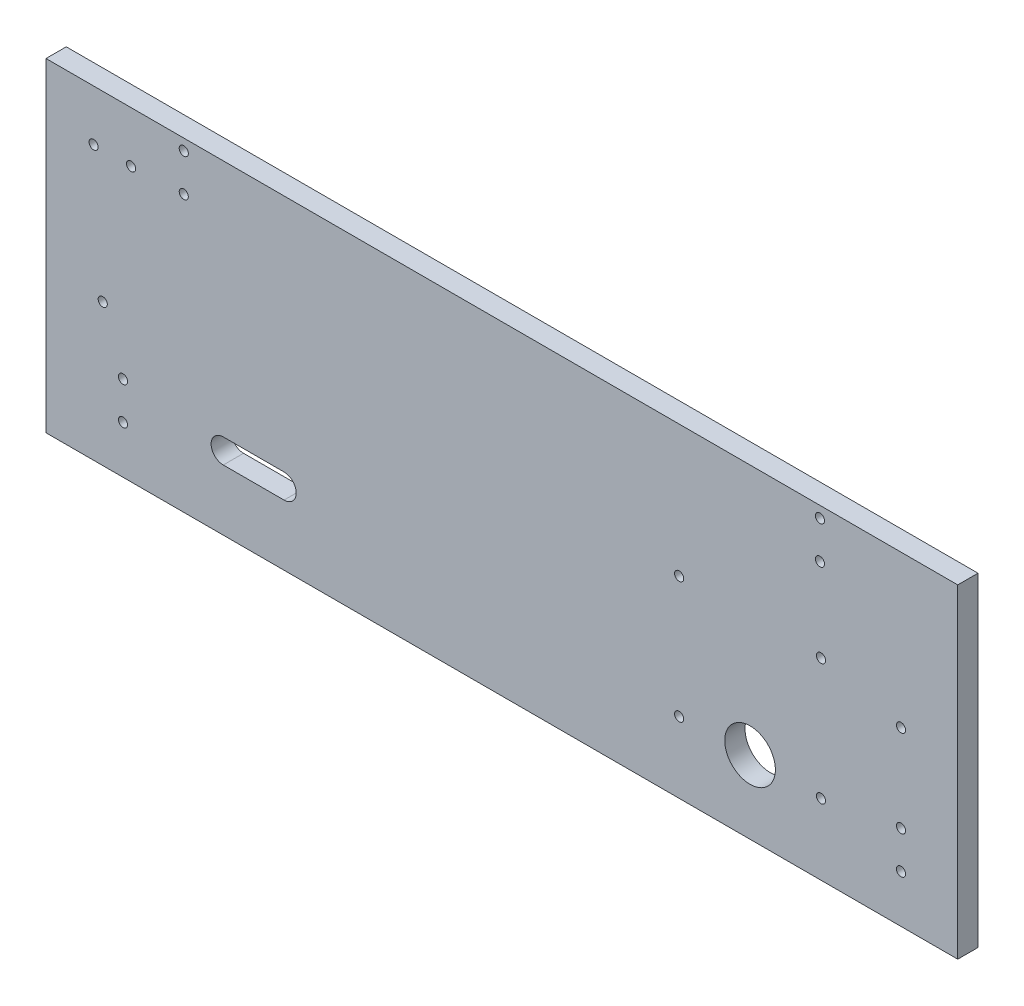
ISO-10303-21;
HEADER;
FILE_DESCRIPTION(('STEP AP214'),'2;1');
FILE_NAME('part.step','',(''),(''),'','','');
FILE_SCHEMA(('AUTOMOTIVE_DESIGN { 1 0 10303 214 1 1 1 1 }'));
ENDSEC;
DATA;
#1=APPLICATION_CONTEXT('core data for automotive mechanical design processes');
#2=APPLICATION_PROTOCOL_DEFINITION('international standard','automotive_design',2000,#1);
#3=PRODUCT_CONTEXT('',#1,'mechanical');
#4=PRODUCT('Part','Part','',(#3));
#5=PRODUCT_RELATED_PRODUCT_CATEGORY('part','',(#4));
#6=PRODUCT_DEFINITION_FORMATION('','',#4);
#7=PRODUCT_DEFINITION_CONTEXT('part definition',#1,'design');
#8=PRODUCT_DEFINITION('design','',#6,#7);
#9=PRODUCT_DEFINITION_SHAPE('','',#8);
#10=(LENGTH_UNIT() NAMED_UNIT(*) SI_UNIT(.MILLI.,.METRE.));
#11=(NAMED_UNIT(*) PLANE_ANGLE_UNIT() SI_UNIT($,.RADIAN.));
#12=(NAMED_UNIT(*) SI_UNIT($,.STERADIAN.) SOLID_ANGLE_UNIT());
#13=UNCERTAINTY_MEASURE_WITH_UNIT(LENGTH_MEASURE(1.E-05),#10,'distance_accuracy_value','');
#14=(GEOMETRIC_REPRESENTATION_CONTEXT(3) GLOBAL_UNCERTAINTY_ASSIGNED_CONTEXT((#13)) GLOBAL_UNIT_ASSIGNED_CONTEXT((#10,
#11,#12)) REPRESENTATION_CONTEXT('',''));
#15=CARTESIAN_POINT('',(0.,0.,0.));
#16=DIRECTION('',(0.,0.,1.));
#17=DIRECTION('',(1.,0.,0.));
#18=AXIS2_PLACEMENT_3D('',#15,#16,#17);
#19=CARTESIAN_POINT('',(0.,0.,10.));
#20=DIRECTION('',(1.,0.,0.));
#21=DIRECTION('',(0.,0.,-1.));
#22=AXIS2_PLACEMENT_3D('',#19,#20,#21);
#23=PLANE('',#22);
#24=DIRECTION('',(0.,-1.,0.));
#25=VECTOR('',#24,1.);
#26=CARTESIAN_POINT('',(0.,0.,0.));
#27=LINE('',#26,#25);
#28=CARTESIAN_POINT('',(0.,160.,0.));
#29=VERTEX_POINT('',#28);
#30=CARTESIAN_POINT('',(0.,0.,0.));
#31=VERTEX_POINT('',#30);
#32=EDGE_CURVE('E158',#29,#31,#27,.T.);
#33=ORIENTED_EDGE('',*,*,#32,.T.);
#34=DIRECTION('',(0.,0.,-1.));
#35=VECTOR('',#34,1.);
#36=CARTESIAN_POINT('',(0.,0.,10.));
#37=LINE('',#36,#35);
#38=CARTESIAN_POINT('',(0.,0.,10.));
#39=VERTEX_POINT('',#38);
#40=EDGE_CURVE('E11',#39,#31,#37,.T.);
#41=ORIENTED_EDGE('',*,*,#40,.F.);
#42=DIRECTION('',(0.,-1.,0.));
#43=VECTOR('',#42,1.);
#44=CARTESIAN_POINT('',(0.,0.,10.));
#45=LINE('',#44,#43);
#46=CARTESIAN_POINT('',(0.,160.,10.));
#47=VERTEX_POINT('',#46);
#48=EDGE_CURVE('E160',#47,#39,#45,.T.);
#49=ORIENTED_EDGE('',*,*,#48,.F.);
#50=DIRECTION('',(0.,0.,-1.));
#51=VECTOR('',#50,1.);
#52=CARTESIAN_POINT('',(0.,160.,10.));
#53=LINE('',#52,#51);
#54=EDGE_CURVE('E170',#47,#29,#53,.T.);
#55=ORIENTED_EDGE('',*,*,#54,.T.);
#56=EDGE_LOOP('',(#33,#41,#49,#55));
#57=FACE_BOUND('',#56,.T.);
#58=ADVANCED_FACE('F37',(#57),#23,.F.);
#59=CARTESIAN_POINT('',(0.,0.,10.));
#60=DIRECTION('',(0.,1.,0.));
#61=DIRECTION('',(0.,0.,1.));
#62=AXIS2_PLACEMENT_3D('',#59,#60,#61);
#63=PLANE('',#62);
#64=DIRECTION('',(1.,0.,0.));
#65=VECTOR('',#64,1.);
#66=CARTESIAN_POINT('',(0.,0.,0.));
#67=LINE('',#66,#65);
#68=CARTESIAN_POINT('',(450.,0.,0.));
#69=VERTEX_POINT('',#68);
#70=EDGE_CURVE('E173',#31,#69,#67,.T.);
#71=ORIENTED_EDGE('',*,*,#70,.T.);
#72=DIRECTION('',(0.,0.,-1.));
#73=VECTOR('',#72,1.);
#74=CARTESIAN_POINT('',(450.,0.,10.));
#75=LINE('',#74,#73);
#76=CARTESIAN_POINT('',(450.,0.,10.));
#77=VERTEX_POINT('',#76);
#78=EDGE_CURVE('E44',#77,#69,#75,.T.);
#79=ORIENTED_EDGE('',*,*,#78,.F.);
#80=DIRECTION('',(1.,0.,0.));
#81=VECTOR('',#80,1.);
#82=CARTESIAN_POINT('',(0.,0.,10.));
#83=LINE('',#82,#81);
#84=EDGE_CURVE('E163',#39,#77,#83,.T.);
#85=ORIENTED_EDGE('',*,*,#84,.F.);
#86=ORIENTED_EDGE('',*,*,#40,.T.);
#87=EDGE_LOOP('',(#71,#79,#85,#86));
#88=FACE_BOUND('',#87,.T.);
#89=ADVANCED_FACE('F202',(#88),#63,.F.);
#90=CARTESIAN_POINT('',(450.,0.,10.));
#91=DIRECTION('',(-1.,0.,0.));
#92=DIRECTION('',(0.,0.,1.));
#93=AXIS2_PLACEMENT_3D('',#90,#91,#92);
#94=PLANE('',#93);
#95=DIRECTION('',(0.,1.,0.));
#96=VECTOR('',#95,1.);
#97=CARTESIAN_POINT('',(450.,0.,0.));
#98=LINE('',#97,#96);
#99=CARTESIAN_POINT('',(450.,160.,0.));
#100=VERTEX_POINT('',#99);
#101=EDGE_CURVE('E175',#69,#100,#98,.T.);
#102=ORIENTED_EDGE('',*,*,#101,.T.);
#103=DIRECTION('',(0.,0.,-1.));
#104=VECTOR('',#103,1.);
#105=CARTESIAN_POINT('',(450.,160.,10.));
#106=LINE('',#105,#104);
#107=CARTESIAN_POINT('',(450.,160.,10.));
#108=VERTEX_POINT('',#107);
#109=EDGE_CURVE('E180',#108,#100,#106,.T.);
#110=ORIENTED_EDGE('',*,*,#109,.F.);
#111=DIRECTION('',(0.,1.,0.));
#112=VECTOR('',#111,1.);
#113=CARTESIAN_POINT('',(450.,0.,10.));
#114=LINE('',#113,#112);
#115=EDGE_CURVE('E166',#77,#108,#114,.T.);
#116=ORIENTED_EDGE('',*,*,#115,.F.);
#117=ORIENTED_EDGE('',*,*,#78,.T.);
#118=EDGE_LOOP('',(#102,#110,#116,#117));
#119=FACE_BOUND('',#118,.T.);
#120=ADVANCED_FACE('F187',(#119),#94,.F.);
#121=CARTESIAN_POINT('',(0.,160.,10.));
#122=DIRECTION('',(0.,-1.,0.));
#123=DIRECTION('',(0.,0.,-1.));
#124=AXIS2_PLACEMENT_3D('',#121,#122,#123);
#125=PLANE('',#124);
#126=DIRECTION('',(-1.,0.,0.));
#127=VECTOR('',#126,1.);
#128=CARTESIAN_POINT('',(0.,160.,0.));
#129=LINE('',#128,#127);
#130=EDGE_CURVE('E164',#100,#29,#129,.T.);
#131=ORIENTED_EDGE('',*,*,#130,.T.);
#132=ORIENTED_EDGE('',*,*,#54,.F.);
#133=DIRECTION('',(-1.,0.,0.));
#134=VECTOR('',#133,1.);
#135=CARTESIAN_POINT('',(0.,160.,10.));
#136=LINE('',#135,#134);
#137=EDGE_CURVE('E168',#108,#47,#136,.T.);
#138=ORIENTED_EDGE('',*,*,#137,.F.);
#139=ORIENTED_EDGE('',*,*,#109,.T.);
#140=EDGE_LOOP('',(#131,#132,#138,#139));
#141=FACE_BOUND('',#140,.T.);
#142=ADVANCED_FACE('F196',(#141),#125,.F.);
#143=CARTESIAN_POINT('',(0.,0.,10.));
#144=DIRECTION('',(0.,0.,-1.));
#145=DIRECTION('',(-1.,0.,0.));
#146=AXIS2_PLACEMENT_3D('',#143,#144,#145);
#147=PLANE('',#146);
#148=CARTESIAN_POINT('',(382.,154.5,10.));
#149=DIRECTION('',(0.,0.,1.));
#150=DIRECTION('',(1.,0.,0.));
#151=AXIS2_PLACEMENT_3D('',#148,#149,#150);
#152=CIRCLE('',#151,2.24999999999996);
#153=CARTESIAN_POINT('',(384.25,154.5,10.));
#154=VERTEX_POINT('',#153);
#155=EDGE_CURVE('E341',#154,#154,#152,.T.);
#156=ORIENTED_EDGE('',*,*,#155,.F.);
#157=EDGE_LOOP('',(#156));
#158=FACE_BOUND('',#157,.T.);
#159=CARTESIAN_POINT('',(68.0000000000001,136.,10.));
#160=DIRECTION('',(0.,0.,1.));
#161=DIRECTION('',(1.,0.,0.));
#162=AXIS2_PLACEMENT_3D('',#159,#160,#161);
#163=CIRCLE('',#162,2.25);
#164=CARTESIAN_POINT('',(70.2500000000001,136.,10.));
#165=VERTEX_POINT('',#164);
#166=EDGE_CURVE('E334',#165,#165,#163,.T.);
#167=ORIENTED_EDGE('',*,*,#166,.F.);
#168=EDGE_LOOP('',(#167));
#169=FACE_BOUND('',#168,.T.);
#170=CARTESIAN_POINT('',(422.,85.,10.));
#171=DIRECTION('',(0.,0.,1.));
#172=DIRECTION('',(1.,0.,0.));
#173=AXIS2_PLACEMENT_3D('',#170,#171,#172);
#174=CIRCLE('',#173,2.24999999999995);
#175=CARTESIAN_POINT('',(424.25,85.,10.));
#176=VERTEX_POINT('',#175);
#177=EDGE_CURVE('E353',#176,#176,#174,.T.);
#178=ORIENTED_EDGE('',*,*,#177,.F.);
#179=EDGE_LOOP('',(#178));
#180=FACE_BOUND('',#179,.T.);
#181=CARTESIAN_POINT('',(68.0000000000001,154.5,10.));
#182=DIRECTION('',(0.,0.,1.));
#183=DIRECTION('',(1.,0.,0.));
#184=AXIS2_PLACEMENT_3D('',#181,#182,#183);
#185=CIRCLE('',#184,2.25);
#186=CARTESIAN_POINT('',(70.2500000000001,154.5,10.));
#187=VERTEX_POINT('',#186);
#188=EDGE_CURVE('E346',#187,#187,#185,.T.);
#189=ORIENTED_EDGE('',*,*,#188,.F.);
#190=EDGE_LOOP('',(#189));
#191=FACE_BOUND('',#190,.T.);
#192=CARTESIAN_POINT('',(422.,41.9999999999999,10.));
#193=DIRECTION('',(0.,0.,1.));
#194=DIRECTION('',(1.,0.,0.));
#195=AXIS2_PLACEMENT_3D('',#192,#193,#194);
#196=CIRCLE('',#195,2.24999999999995);
#197=CARTESIAN_POINT('',(424.25,41.9999999999999,10.));
#198=VERTEX_POINT('',#197);
#199=EDGE_CURVE('E309',#198,#198,#196,.T.);
#200=ORIENTED_EDGE('',*,*,#199,.F.);
#201=EDGE_LOOP('',(#200));
#202=FACE_BOUND('',#201,.T.);
#203=CARTESIAN_POINT('',(38.,23.5,10.));
#204=DIRECTION('',(0.,0.,1.));
#205=DIRECTION('',(1.,0.,0.));
#206=AXIS2_PLACEMENT_3D('',#203,#204,#205);
#207=CIRCLE('',#206,2.25);
#208=CARTESIAN_POINT('',(40.25,23.5,10.));
#209=VERTEX_POINT('',#208);
#210=EDGE_CURVE('E313',#209,#209,#207,.T.);
#211=ORIENTED_EDGE('',*,*,#210,.F.);
#212=EDGE_LOOP('',(#211));
#213=FACE_BOUND('',#212,.T.);
#214=CARTESIAN_POINT('',(38.,42.,10.));
#215=DIRECTION('',(0.,0.,1.));
#216=DIRECTION('',(1.,0.,0.));
#217=AXIS2_PLACEMENT_3D('',#214,#215,#216);
#218=CIRCLE('',#217,2.25);
#219=CARTESIAN_POINT('',(40.25,42.,10.));
#220=VERTEX_POINT('',#219);
#221=EDGE_CURVE('E329',#220,#220,#218,.T.);
#222=ORIENTED_EDGE('',*,*,#221,.F.);
#223=EDGE_LOOP('',(#222));
#224=FACE_BOUND('',#223,.T.);
#225=CARTESIAN_POINT('',(382.,136.,10.));
#226=DIRECTION('',(0.,0.,1.));
#227=DIRECTION('',(1.,0.,0.));
#228=AXIS2_PLACEMENT_3D('',#225,#226,#227);
#229=CIRCLE('',#228,2.24999999999996);
#230=CARTESIAN_POINT('',(384.25,136.,10.));
#231=VERTEX_POINT('',#230);
#232=EDGE_CURVE('E322',#231,#231,#229,.T.);
#233=ORIENTED_EDGE('',*,*,#232,.F.);
#234=EDGE_LOOP('',(#233));
#235=FACE_BOUND('',#234,.T.);
#236=DIRECTION('',(1.,0.,0.));
#237=VECTOR('',#236,1.);
#238=CARTESIAN_POINT('',(87.5,30.,10.));
#239=LINE('',#238,#237);
#240=CARTESIAN_POINT('',(87.5,30.,10.));
#241=VERTEX_POINT('',#240);
#242=CARTESIAN_POINT('',(117.5,30.,10.));
#243=VERTEX_POINT('',#242);
#244=EDGE_CURVE('E122',#241,#243,#239,.T.);
#245=ORIENTED_EDGE('',*,*,#244,.F.);
#246=CARTESIAN_POINT('',(87.5,36.,10.));
#247=DIRECTION('',(0.,0.,1.));
#248=DIRECTION('',(1.,0.,0.));
#249=AXIS2_PLACEMENT_3D('',#246,#247,#248);
#250=CIRCLE('',#249,6.);
#251=CARTESIAN_POINT('',(87.5,42.,10.));
#252=VERTEX_POINT('',#251);
#253=EDGE_CURVE('E51',#252,#241,#250,.T.);
#254=ORIENTED_EDGE('',*,*,#253,.F.);
#255=DIRECTION('',(-1.,0.,0.));
#256=VECTOR('',#255,1.);
#257=CARTESIAN_POINT('',(87.5,42.,10.));
#258=LINE('',#257,#256);
#259=CARTESIAN_POINT('',(117.5,42.,10.));
#260=VERTEX_POINT('',#259);
#261=EDGE_CURVE('E111',#260,#252,#258,.T.);
#262=ORIENTED_EDGE('',*,*,#261,.F.);
#263=CARTESIAN_POINT('',(117.5,36.,10.));
#264=DIRECTION('',(0.,0.,1.));
#265=DIRECTION('',(1.,0.,0.));
#266=AXIS2_PLACEMENT_3D('',#263,#264,#265);
#267=CIRCLE('',#266,6.);
#268=EDGE_CURVE('E116',#243,#260,#267,.T.);
#269=ORIENTED_EDGE('',*,*,#268,.F.);
#270=EDGE_LOOP('',(#245,#254,#262,#269));
#271=FACE_BOUND('',#270,.T.);
#272=CARTESIAN_POINT('',(312.5,94.9999999999999,10.));
#273=DIRECTION('',(0.,0.,1.));
#274=DIRECTION('',(1.,0.,0.));
#275=AXIS2_PLACEMENT_3D('',#272,#273,#274);
#276=CIRCLE('',#275,2.24999999999995);
#277=CARTESIAN_POINT('',(314.75,94.9999999999999,10.));
#278=VERTEX_POINT('',#277);
#279=EDGE_CURVE('E108',#278,#278,#276,.T.);
#280=ORIENTED_EDGE('',*,*,#279,.F.);
#281=EDGE_LOOP('',(#280));
#282=FACE_BOUND('',#281,.T.);
#283=CARTESIAN_POINT('',(382.5,94.9999999999999,10.));
#284=DIRECTION('',(0.,0.,1.));
#285=DIRECTION('',(1.,0.,0.));
#286=AXIS2_PLACEMENT_3D('',#283,#284,#285);
#287=CIRCLE('',#286,2.24999999999995);
#288=CARTESIAN_POINT('',(384.75,94.9999999999999,10.));
#289=VERTEX_POINT('',#288);
#290=EDGE_CURVE('E144',#289,#289,#287,.T.);
#291=ORIENTED_EDGE('',*,*,#290,.F.);
#292=EDGE_LOOP('',(#291));
#293=FACE_BOUND('',#292,.T.);
#294=CARTESIAN_POINT('',(382.5,34.9999999999999,10.));
#295=DIRECTION('',(0.,0.,1.));
#296=DIRECTION('',(1.,0.,0.));
#297=AXIS2_PLACEMENT_3D('',#294,#295,#296);
#298=CIRCLE('',#297,2.24999999999995);
#299=CARTESIAN_POINT('',(384.75,34.9999999999999,10.));
#300=VERTEX_POINT('',#299);
#301=EDGE_CURVE('E150',#300,#300,#298,.T.);
#302=ORIENTED_EDGE('',*,*,#301,.F.);
#303=EDGE_LOOP('',(#302));
#304=FACE_BOUND('',#303,.T.);
#305=CARTESIAN_POINT('',(28.0000000000001,70.,10.));
#306=DIRECTION('',(0.,0.,1.));
#307=DIRECTION('',(1.,0.,0.));
#308=AXIS2_PLACEMENT_3D('',#305,#306,#307);
#309=CIRCLE('',#308,2.25);
#310=CARTESIAN_POINT('',(30.2500000000001,70.,10.));
#311=VERTEX_POINT('',#310);
#312=EDGE_CURVE('E365',#311,#311,#309,.T.);
#313=ORIENTED_EDGE('',*,*,#312,.F.);
#314=EDGE_LOOP('',(#313));
#315=FACE_BOUND('',#314,.T.);
#316=CARTESIAN_POINT('',(42.,134.933694221876,10.));
#317=DIRECTION('',(0.,0.,1.));
#318=DIRECTION('',(1.,0.,0.));
#319=AXIS2_PLACEMENT_3D('',#316,#317,#318);
#320=CIRCLE('',#319,2.25);
#321=CARTESIAN_POINT('',(44.25,134.933694221876,10.));
#322=VERTEX_POINT('',#321);
#323=EDGE_CURVE('E358',#322,#322,#320,.T.);
#324=ORIENTED_EDGE('',*,*,#323,.F.);
#325=EDGE_LOOP('',(#324));
#326=FACE_BOUND('',#325,.T.);
#327=CARTESIAN_POINT('',(23.5,134.933694221876,10.));
#328=DIRECTION('',(0.,0.,1.));
#329=DIRECTION('',(1.,0.,0.));
#330=AXIS2_PLACEMENT_3D('',#327,#328,#329);
#331=CIRCLE('',#330,2.25);
#332=CARTESIAN_POINT('',(25.75,134.933694221876,10.));
#333=VERTEX_POINT('',#332);
#334=EDGE_CURVE('E375',#333,#333,#331,.T.);
#335=ORIENTED_EDGE('',*,*,#334,.F.);
#336=EDGE_LOOP('',(#335));
#337=FACE_BOUND('',#336,.T.);
#338=CARTESIAN_POINT('',(312.5,34.9999999999999,10.));
#339=DIRECTION('',(0.,0.,1.));
#340=DIRECTION('',(1.,0.,0.));
#341=AXIS2_PLACEMENT_3D('',#338,#339,#340);
#342=CIRCLE('',#341,2.24999999999995);
#343=CARTESIAN_POINT('',(314.75,34.9999999999999,10.));
#344=VERTEX_POINT('',#343);
#345=EDGE_CURVE('E156',#344,#344,#342,.T.);
#346=ORIENTED_EDGE('',*,*,#345,.F.);
#347=EDGE_LOOP('',(#346));
#348=FACE_BOUND('',#347,.T.);
#349=CARTESIAN_POINT('',(422.,23.4999999999999,10.));
#350=DIRECTION('',(0.,0.,1.));
#351=DIRECTION('',(1.,0.,0.));
#352=AXIS2_PLACEMENT_3D('',#349,#350,#351);
#353=CIRCLE('',#352,2.24999999999995);
#354=CARTESIAN_POINT('',(424.25,23.4999999999999,10.));
#355=VERTEX_POINT('',#354);
#356=EDGE_CURVE('E304',#355,#355,#353,.T.);
#357=ORIENTED_EDGE('',*,*,#356,.F.);
#358=EDGE_LOOP('',(#357));
#359=FACE_BOUND('',#358,.T.);
#360=CARTESIAN_POINT('',(347.5,36.,10.));
#361=DIRECTION('',(0.,0.,1.));
#362=DIRECTION('',(1.,0.,0.));
#363=AXIS2_PLACEMENT_3D('',#360,#361,#362);
#364=CIRCLE('',#363,12.5);
#365=CARTESIAN_POINT('',(360.,36.,10.));
#366=VERTEX_POINT('',#365);
#367=EDGE_CURVE('E123',#366,#366,#364,.T.);
#368=ORIENTED_EDGE('',*,*,#367,.F.);
#369=EDGE_LOOP('',(#368));
#370=FACE_BOUND('',#369,.T.);
#371=ORIENTED_EDGE('',*,*,#48,.T.);
#372=ORIENTED_EDGE('',*,*,#84,.T.);
#373=ORIENTED_EDGE('',*,*,#115,.T.);
#374=ORIENTED_EDGE('',*,*,#137,.T.);
#375=EDGE_LOOP('',(#371,#372,#373,#374));
#376=FACE_BOUND('',#375,.T.);
#377=ADVANCED_FACE('F119',(#158,#169,#180,#191,#202,#213,#224,#235,#271,#282,#293,#304,#315,
#326,#337,#348,#359,#370,#376),#147,.F.);
#378=CARTESIAN_POINT('',(0.,0.,0.));
#379=DIRECTION('',(0.,0.,-1.));
#380=DIRECTION('',(-1.,0.,0.));
#381=AXIS2_PLACEMENT_3D('',#378,#379,#380);
#382=PLANE('',#381);
#383=CARTESIAN_POINT('',(382.,154.5,0.));
#384=DIRECTION('',(0.,0.,1.));
#385=DIRECTION('',(1.,0.,0.));
#386=AXIS2_PLACEMENT_3D('',#383,#384,#385);
#387=CIRCLE('',#386,2.24999999999996);
#388=CARTESIAN_POINT('',(384.25,154.5,0.));
#389=VERTEX_POINT('',#388);
#390=EDGE_CURVE('E325',#389,#389,#387,.T.);
#391=ORIENTED_EDGE('',*,*,#390,.T.);
#392=EDGE_LOOP('',(#391));
#393=FACE_BOUND('',#392,.T.);
#394=CARTESIAN_POINT('',(68.0000000000001,136.,0.));
#395=DIRECTION('',(0.,0.,1.));
#396=DIRECTION('',(1.,0.,0.));
#397=AXIS2_PLACEMENT_3D('',#394,#395,#396);
#398=CIRCLE('',#397,2.25);
#399=CARTESIAN_POINT('',(70.2500000000001,136.,0.));
#400=VERTEX_POINT('',#399);
#401=EDGE_CURVE('E338',#400,#400,#398,.T.);
#402=ORIENTED_EDGE('',*,*,#401,.T.);
#403=EDGE_LOOP('',(#402));
#404=FACE_BOUND('',#403,.T.);
#405=CARTESIAN_POINT('',(422.,85.,0.));
#406=DIRECTION('',(0.,0.,1.));
#407=DIRECTION('',(1.,0.,0.));
#408=AXIS2_PLACEMENT_3D('',#405,#406,#407);
#409=CIRCLE('',#408,2.24999999999995);
#410=CARTESIAN_POINT('',(424.25,85.,0.));
#411=VERTEX_POINT('',#410);
#412=EDGE_CURVE('E337',#411,#411,#409,.T.);
#413=ORIENTED_EDGE('',*,*,#412,.T.);
#414=EDGE_LOOP('',(#413));
#415=FACE_BOUND('',#414,.T.);
#416=CARTESIAN_POINT('',(68.0000000000001,154.5,0.));
#417=DIRECTION('',(0.,0.,1.));
#418=DIRECTION('',(1.,0.,0.));
#419=AXIS2_PLACEMENT_3D('',#416,#417,#418);
#420=CIRCLE('',#419,2.25);
#421=CARTESIAN_POINT('',(70.2500000000001,154.5,0.));
#422=VERTEX_POINT('',#421);
#423=EDGE_CURVE('E350',#422,#422,#420,.T.);
#424=ORIENTED_EDGE('',*,*,#423,.T.);
#425=EDGE_LOOP('',(#424));
#426=FACE_BOUND('',#425,.T.);
#427=CARTESIAN_POINT('',(422.,41.9999999999999,0.));
#428=DIRECTION('',(0.,0.,1.));
#429=DIRECTION('',(1.,0.,0.));
#430=AXIS2_PLACEMENT_3D('',#427,#428,#429);
#431=CIRCLE('',#430,2.24999999999995);
#432=CARTESIAN_POINT('',(424.25,41.9999999999999,0.));
#433=VERTEX_POINT('',#432);
#434=EDGE_CURVE('E306',#433,#433,#431,.T.);
#435=ORIENTED_EDGE('',*,*,#434,.T.);
#436=EDGE_LOOP('',(#435));
#437=FACE_BOUND('',#436,.T.);
#438=CARTESIAN_POINT('',(38.,23.5,0.));
#439=DIRECTION('',(0.,0.,1.));
#440=DIRECTION('',(1.,0.,0.));
#441=AXIS2_PLACEMENT_3D('',#438,#439,#440);
#442=CIRCLE('',#441,2.25);
#443=CARTESIAN_POINT('',(40.25,23.5,0.));
#444=VERTEX_POINT('',#443);
#445=EDGE_CURVE('E317',#444,#444,#442,.T.);
#446=ORIENTED_EDGE('',*,*,#445,.T.);
#447=EDGE_LOOP('',(#446));
#448=FACE_BOUND('',#447,.T.);
#449=CARTESIAN_POINT('',(38.,42.,0.));
#450=DIRECTION('',(0.,0.,1.));
#451=DIRECTION('',(1.,0.,0.));
#452=AXIS2_PLACEMENT_3D('',#449,#450,#451);
#453=CIRCLE('',#452,2.25);
#454=CARTESIAN_POINT('',(40.25,42.,0.));
#455=VERTEX_POINT('',#454);
#456=EDGE_CURVE('E316',#455,#455,#453,.T.);
#457=ORIENTED_EDGE('',*,*,#456,.T.);
#458=EDGE_LOOP('',(#457));
#459=FACE_BOUND('',#458,.T.);
#460=CARTESIAN_POINT('',(382.,136.,0.));
#461=DIRECTION('',(0.,0.,1.));
#462=DIRECTION('',(1.,0.,0.));
#463=AXIS2_PLACEMENT_3D('',#460,#461,#462);
#464=CIRCLE('',#463,2.24999999999996);
#465=CARTESIAN_POINT('',(384.25,136.,0.));
#466=VERTEX_POINT('',#465);
#467=EDGE_CURVE('E326',#466,#466,#464,.T.);
#468=ORIENTED_EDGE('',*,*,#467,.T.);
#469=EDGE_LOOP('',(#468));
#470=FACE_BOUND('',#469,.T.);
#471=CARTESIAN_POINT('',(87.5,36.,0.));
#472=DIRECTION('',(0.,0.,1.));
#473=DIRECTION('',(1.,0.,0.));
#474=AXIS2_PLACEMENT_3D('',#471,#472,#473);
#475=CIRCLE('',#474,6.);
#476=CARTESIAN_POINT('',(87.5,42.,0.));
#477=VERTEX_POINT('',#476);
#478=CARTESIAN_POINT('',(87.5,30.,0.));
#479=VERTEX_POINT('',#478);
#480=EDGE_CURVE('E103',#477,#479,#475,.T.);
#481=ORIENTED_EDGE('',*,*,#480,.T.);
#482=DIRECTION('',(1.,0.,0.));
#483=VECTOR('',#482,1.);
#484=CARTESIAN_POINT('',(87.5,30.,0.));
#485=LINE('',#484,#483);
#486=CARTESIAN_POINT('',(117.5,30.,0.));
#487=VERTEX_POINT('',#486);
#488=EDGE_CURVE('E135',#479,#487,#485,.T.);
#489=ORIENTED_EDGE('',*,*,#488,.T.);
#490=CARTESIAN_POINT('',(117.5,36.,0.));
#491=DIRECTION('',(0.,0.,1.));
#492=DIRECTION('',(1.,0.,0.));
#493=AXIS2_PLACEMENT_3D('',#490,#491,#492);
#494=CIRCLE('',#493,6.);
#495=CARTESIAN_POINT('',(117.5,42.,0.));
#496=VERTEX_POINT('',#495);
#497=EDGE_CURVE('E59',#487,#496,#494,.T.);
#498=ORIENTED_EDGE('',*,*,#497,.T.);
#499=DIRECTION('',(-1.,0.,0.));
#500=VECTOR('',#499,1.);
#501=CARTESIAN_POINT('',(87.5,42.,0.));
#502=LINE('',#501,#500);
#503=EDGE_CURVE('E131',#496,#477,#502,.T.);
#504=ORIENTED_EDGE('',*,*,#503,.T.);
#505=EDGE_LOOP('',(#481,#489,#498,#504));
#506=FACE_BOUND('',#505,.T.);
#507=CARTESIAN_POINT('',(312.5,94.9999999999999,0.));
#508=DIRECTION('',(0.,0.,1.));
#509=DIRECTION('',(1.,0.,0.));
#510=AXIS2_PLACEMENT_3D('',#507,#508,#509);
#511=CIRCLE('',#510,2.24999999999995);
#512=CARTESIAN_POINT('',(314.75,94.9999999999999,0.));
#513=VERTEX_POINT('',#512);
#514=EDGE_CURVE('E141',#513,#513,#511,.T.);
#515=ORIENTED_EDGE('',*,*,#514,.T.);
#516=EDGE_LOOP('',(#515));
#517=FACE_BOUND('',#516,.T.);
#518=CARTESIAN_POINT('',(382.5,94.9999999999999,0.));
#519=DIRECTION('',(0.,0.,1.));
#520=DIRECTION('',(1.,0.,0.));
#521=AXIS2_PLACEMENT_3D('',#518,#519,#520);
#522=CIRCLE('',#521,2.24999999999995);
#523=CARTESIAN_POINT('',(384.75,94.9999999999999,0.));
#524=VERTEX_POINT('',#523);
#525=EDGE_CURVE('E147',#524,#524,#522,.T.);
#526=ORIENTED_EDGE('',*,*,#525,.T.);
#527=EDGE_LOOP('',(#526));
#528=FACE_BOUND('',#527,.T.);
#529=CARTESIAN_POINT('',(382.5,34.9999999999999,0.));
#530=DIRECTION('',(0.,0.,1.));
#531=DIRECTION('',(1.,0.,0.));
#532=AXIS2_PLACEMENT_3D('',#529,#530,#531);
#533=CIRCLE('',#532,2.24999999999995);
#534=CARTESIAN_POINT('',(384.75,34.9999999999999,0.));
#535=VERTEX_POINT('',#534);
#536=EDGE_CURVE('E153',#535,#535,#533,.T.);
#537=ORIENTED_EDGE('',*,*,#536,.T.);
#538=EDGE_LOOP('',(#537));
#539=FACE_BOUND('',#538,.T.);
#540=CARTESIAN_POINT('',(28.0000000000001,70.,0.));
#541=DIRECTION('',(0.,0.,1.));
#542=DIRECTION('',(1.,0.,0.));
#543=AXIS2_PLACEMENT_3D('',#540,#541,#542);
#544=CIRCLE('',#543,2.25);
#545=CARTESIAN_POINT('',(30.2500000000001,70.,0.));
#546=VERTEX_POINT('',#545);
#547=EDGE_CURVE('E349',#546,#546,#544,.T.);
#548=ORIENTED_EDGE('',*,*,#547,.T.);
#549=EDGE_LOOP('',(#548));
#550=FACE_BOUND('',#549,.T.);
#551=CARTESIAN_POINT('',(42.,134.933694221876,0.));
#552=DIRECTION('',(0.,0.,1.));
#553=DIRECTION('',(1.,0.,0.));
#554=AXIS2_PLACEMENT_3D('',#551,#552,#553);
#555=CIRCLE('',#554,2.25);
#556=CARTESIAN_POINT('',(44.25,134.933694221876,0.));
#557=VERTEX_POINT('',#556);
#558=EDGE_CURVE('E362',#557,#557,#555,.T.);
#559=ORIENTED_EDGE('',*,*,#558,.T.);
#560=EDGE_LOOP('',(#559));
#561=FACE_BOUND('',#560,.T.);
#562=CARTESIAN_POINT('',(23.5,134.933694221876,0.));
#563=DIRECTION('',(0.,0.,1.));
#564=DIRECTION('',(1.,0.,0.));
#565=AXIS2_PLACEMENT_3D('',#562,#563,#564);
#566=CIRCLE('',#565,2.25);
#567=CARTESIAN_POINT('',(25.75,134.933694221876,0.));
#568=VERTEX_POINT('',#567);
#569=EDGE_CURVE('E361',#568,#568,#566,.T.);
#570=ORIENTED_EDGE('',*,*,#569,.T.);
#571=EDGE_LOOP('',(#570));
#572=FACE_BOUND('',#571,.T.);
#573=CARTESIAN_POINT('',(312.5,34.9999999999999,0.));
#574=DIRECTION('',(0.,0.,1.));
#575=DIRECTION('',(1.,0.,0.));
#576=AXIS2_PLACEMENT_3D('',#573,#574,#575);
#577=CIRCLE('',#576,2.24999999999995);
#578=CARTESIAN_POINT('',(314.75,34.9999999999999,0.));
#579=VERTEX_POINT('',#578);
#580=EDGE_CURVE('E372',#579,#579,#577,.T.);
#581=ORIENTED_EDGE('',*,*,#580,.T.);
#582=EDGE_LOOP('',(#581));
#583=FACE_BOUND('',#582,.T.);
#584=CARTESIAN_POINT('',(422.,23.4999999999999,0.));
#585=DIRECTION('',(0.,0.,1.));
#586=DIRECTION('',(1.,0.,0.));
#587=AXIS2_PLACEMENT_3D('',#584,#585,#586);
#588=CIRCLE('',#587,2.24999999999995);
#589=CARTESIAN_POINT('',(424.25,23.4999999999999,0.));
#590=VERTEX_POINT('',#589);
#591=EDGE_CURVE('E301',#590,#590,#588,.T.);
#592=ORIENTED_EDGE('',*,*,#591,.T.);
#593=EDGE_LOOP('',(#592));
#594=FACE_BOUND('',#593,.T.);
#595=CARTESIAN_POINT('',(347.5,36.,0.));
#596=DIRECTION('',(0.,0.,1.));
#597=DIRECTION('',(1.,0.,0.));
#598=AXIS2_PLACEMENT_3D('',#595,#596,#597);
#599=CIRCLE('',#598,12.5);
#600=CARTESIAN_POINT('',(360.,36.,0.));
#601=VERTEX_POINT('',#600);
#602=EDGE_CURVE('E126',#601,#601,#599,.T.);
#603=ORIENTED_EDGE('',*,*,#602,.T.);
#604=EDGE_LOOP('',(#603));
#605=FACE_BOUND('',#604,.T.);
#606=ORIENTED_EDGE('',*,*,#32,.F.);
#607=ORIENTED_EDGE('',*,*,#130,.F.);
#608=ORIENTED_EDGE('',*,*,#101,.F.);
#609=ORIENTED_EDGE('',*,*,#70,.F.);
#610=EDGE_LOOP('',(#606,#607,#608,#609));
#611=FACE_BOUND('',#610,.T.);
#612=ADVANCED_FACE('F193',(#393,#404,#415,#426,#437,#448,#459,#470,#506,#517,#528,#539,#550,
#561,#572,#583,#594,#605,#611),#382,.T.);
#613=CARTESIAN_POINT('',(347.5,36.,0.));
#614=DIRECTION('',(0.,0.,1.));
#615=DIRECTION('',(1.,0.,0.));
#616=AXIS2_PLACEMENT_3D('',#613,#614,#615);
#617=CYLINDRICAL_SURFACE('',#616,12.5);
#618=ORIENTED_EDGE('',*,*,#602,.F.);
#619=EDGE_LOOP('',(#618));
#620=FACE_BOUND('',#619,.T.);
#621=ORIENTED_EDGE('',*,*,#367,.T.);
#622=EDGE_LOOP('',(#621));
#623=FACE_BOUND('',#622,.T.);
#624=ADVANCED_FACE('F214',(#620,#623),#617,.F.);
#625=CARTESIAN_POINT('',(422.,23.4999999999999,0.));
#626=DIRECTION('',(0.,0.,1.));
#627=DIRECTION('',(1.,0.,0.));
#628=AXIS2_PLACEMENT_3D('',#625,#626,#627);
#629=CYLINDRICAL_SURFACE('',#628,2.24999999999995);
#630=ORIENTED_EDGE('',*,*,#591,.F.);
#631=EDGE_LOOP('',(#630));
#632=FACE_BOUND('',#631,.T.);
#633=ORIENTED_EDGE('',*,*,#356,.T.);
#634=EDGE_LOOP('',(#633));
#635=FACE_BOUND('',#634,.T.);
#636=ADVANCED_FACE('F221',(#632,#635),#629,.F.);
#637=CARTESIAN_POINT('',(312.5,34.9999999999999,0.));
#638=DIRECTION('',(0.,0.,1.));
#639=DIRECTION('',(1.,0.,0.));
#640=AXIS2_PLACEMENT_3D('',#637,#638,#639);
#641=CYLINDRICAL_SURFACE('',#640,2.24999999999995);
#642=ORIENTED_EDGE('',*,*,#580,.F.);
#643=EDGE_LOOP('',(#642));
#644=FACE_BOUND('',#643,.T.);
#645=ORIENTED_EDGE('',*,*,#345,.T.);
#646=EDGE_LOOP('',(#645));
#647=FACE_BOUND('',#646,.T.);
#648=ADVANCED_FACE('F252',(#644,#647),#641,.F.);
#649=CARTESIAN_POINT('',(23.5,134.933694221876,0.));
#650=DIRECTION('',(0.,0.,1.));
#651=DIRECTION('',(1.,0.,0.));
#652=AXIS2_PLACEMENT_3D('',#649,#650,#651);
#653=CYLINDRICAL_SURFACE('',#652,2.25);
#654=ORIENTED_EDGE('',*,*,#569,.F.);
#655=EDGE_LOOP('',(#654));
#656=FACE_BOUND('',#655,.T.);
#657=ORIENTED_EDGE('',*,*,#334,.T.);
#658=EDGE_LOOP('',(#657));
#659=FACE_BOUND('',#658,.T.);
#660=ADVANCED_FACE('F248',(#656,#659),#653,.F.);
#661=CARTESIAN_POINT('',(42.,134.933694221876,0.));
#662=DIRECTION('',(0.,0.,1.));
#663=DIRECTION('',(1.,0.,0.));
#664=AXIS2_PLACEMENT_3D('',#661,#662,#663);
#665=CYLINDRICAL_SURFACE('',#664,2.25);
#666=ORIENTED_EDGE('',*,*,#558,.F.);
#667=EDGE_LOOP('',(#666));
#668=FACE_BOUND('',#667,.T.);
#669=ORIENTED_EDGE('',*,*,#323,.T.);
#670=EDGE_LOOP('',(#669));
#671=FACE_BOUND('',#670,.T.);
#672=ADVANCED_FACE('F251',(#668,#671),#665,.F.);
#673=CARTESIAN_POINT('',(28.0000000000001,70.,0.));
#674=DIRECTION('',(0.,0.,1.));
#675=DIRECTION('',(1.,0.,0.));
#676=AXIS2_PLACEMENT_3D('',#673,#674,#675);
#677=CYLINDRICAL_SURFACE('',#676,2.25);
#678=ORIENTED_EDGE('',*,*,#547,.F.);
#679=EDGE_LOOP('',(#678));
#680=FACE_BOUND('',#679,.T.);
#681=ORIENTED_EDGE('',*,*,#312,.T.);
#682=EDGE_LOOP('',(#681));
#683=FACE_BOUND('',#682,.T.);
#684=ADVANCED_FACE('F227',(#680,#683),#677,.F.);
#685=CARTESIAN_POINT('',(382.5,34.9999999999999,0.));
#686=DIRECTION('',(0.,0.,1.));
#687=DIRECTION('',(1.,0.,0.));
#688=AXIS2_PLACEMENT_3D('',#685,#686,#687);
#689=CYLINDRICAL_SURFACE('',#688,2.24999999999995);
#690=ORIENTED_EDGE('',*,*,#536,.F.);
#691=EDGE_LOOP('',(#690));
#692=FACE_BOUND('',#691,.T.);
#693=ORIENTED_EDGE('',*,*,#301,.T.);
#694=EDGE_LOOP('',(#693));
#695=FACE_BOUND('',#694,.T.);
#696=ADVANCED_FACE('F223',(#692,#695),#689,.F.);
#697=CARTESIAN_POINT('',(382.5,94.9999999999999,0.));
#698=DIRECTION('',(0.,0.,1.));
#699=DIRECTION('',(1.,0.,0.));
#700=AXIS2_PLACEMENT_3D('',#697,#698,#699);
#701=CYLINDRICAL_SURFACE('',#700,2.24999999999995);
#702=ORIENTED_EDGE('',*,*,#525,.F.);
#703=EDGE_LOOP('',(#702));
#704=FACE_BOUND('',#703,.T.);
#705=ORIENTED_EDGE('',*,*,#290,.T.);
#706=EDGE_LOOP('',(#705));
#707=FACE_BOUND('',#706,.T.);
#708=ADVANCED_FACE('F226',(#704,#707),#701,.F.);
#709=CARTESIAN_POINT('',(312.5,94.9999999999999,0.));
#710=DIRECTION('',(0.,0.,1.));
#711=DIRECTION('',(1.,0.,0.));
#712=AXIS2_PLACEMENT_3D('',#709,#710,#711);
#713=CYLINDRICAL_SURFACE('',#712,2.24999999999995);
#714=ORIENTED_EDGE('',*,*,#514,.F.);
#715=EDGE_LOOP('',(#714));
#716=FACE_BOUND('',#715,.T.);
#717=ORIENTED_EDGE('',*,*,#279,.T.);
#718=EDGE_LOOP('',(#717));
#719=FACE_BOUND('',#718,.T.);
#720=ADVANCED_FACE('F231',(#716,#719),#713,.F.);
#721=CARTESIAN_POINT('',(87.5,36.,0.));
#722=DIRECTION('',(0.,0.,1.));
#723=DIRECTION('',(1.,0.,0.));
#724=AXIS2_PLACEMENT_3D('',#721,#722,#723);
#725=CYLINDRICAL_SURFACE('',#724,6.);
#726=ORIENTED_EDGE('',*,*,#253,.T.);
#727=DIRECTION('',(0.,0.,1.));
#728=VECTOR('',#727,1.);
#729=CARTESIAN_POINT('',(87.5,30.,0.));
#730=LINE('',#729,#728);
#731=EDGE_CURVE('E133',#479,#241,#730,.T.);
#732=ORIENTED_EDGE('',*,*,#731,.F.);
#733=ORIENTED_EDGE('',*,*,#480,.F.);
#734=DIRECTION('',(0.,0.,1.));
#735=VECTOR('',#734,1.);
#736=CARTESIAN_POINT('',(87.5,42.,0.));
#737=LINE('',#736,#735);
#738=EDGE_CURVE('E99',#477,#252,#737,.T.);
#739=ORIENTED_EDGE('',*,*,#738,.T.);
#740=EDGE_LOOP('',(#726,#732,#733,#739));
#741=FACE_BOUND('',#740,.T.);
#742=ADVANCED_FACE('F101',(#741),#725,.F.);
#743=CARTESIAN_POINT('',(87.5,42.,0.));
#744=DIRECTION('',(0.,1.,0.));
#745=DIRECTION('',(-1.,0.,0.));
#746=AXIS2_PLACEMENT_3D('',#743,#744,#745);
#747=PLANE('',#746);
#748=ORIENTED_EDGE('',*,*,#261,.T.);
#749=ORIENTED_EDGE('',*,*,#738,.F.);
#750=ORIENTED_EDGE('',*,*,#503,.F.);
#751=DIRECTION('',(0.,0.,1.));
#752=VECTOR('',#751,1.);
#753=CARTESIAN_POINT('',(117.5,42.,0.));
#754=LINE('',#753,#752);
#755=EDGE_CURVE('E107',#496,#260,#754,.T.);
#756=ORIENTED_EDGE('',*,*,#755,.T.);
#757=EDGE_LOOP('',(#748,#749,#750,#756));
#758=FACE_BOUND('',#757,.T.);
#759=ADVANCED_FACE('F112',(#758),#747,.F.);
#760=CARTESIAN_POINT('',(117.5,36.,0.));
#761=DIRECTION('',(0.,0.,1.));
#762=DIRECTION('',(1.,0.,0.));
#763=AXIS2_PLACEMENT_3D('',#760,#761,#762);
#764=CYLINDRICAL_SURFACE('',#763,6.);
#765=ORIENTED_EDGE('',*,*,#268,.T.);
#766=ORIENTED_EDGE('',*,*,#755,.F.);
#767=ORIENTED_EDGE('',*,*,#497,.F.);
#768=DIRECTION('',(0.,0.,1.));
#769=VECTOR('',#768,1.);
#770=CARTESIAN_POINT('',(117.5,30.,0.));
#771=LINE('',#770,#769);
#772=EDGE_CURVE('E381',#487,#243,#771,.T.);
#773=ORIENTED_EDGE('',*,*,#772,.T.);
#774=EDGE_LOOP('',(#765,#766,#767,#773));
#775=FACE_BOUND('',#774,.T.);
#776=ADVANCED_FACE('F238',(#775),#764,.F.);
#777=CARTESIAN_POINT('',(87.5,30.,0.));
#778=DIRECTION('',(0.,-1.,0.));
#779=DIRECTION('',(1.,0.,0.));
#780=AXIS2_PLACEMENT_3D('',#777,#778,#779);
#781=PLANE('',#780);
#782=ORIENTED_EDGE('',*,*,#244,.T.);
#783=ORIENTED_EDGE('',*,*,#772,.F.);
#784=ORIENTED_EDGE('',*,*,#488,.F.);
#785=ORIENTED_EDGE('',*,*,#731,.T.);
#786=EDGE_LOOP('',(#782,#783,#784,#785));
#787=FACE_BOUND('',#786,.T.);
#788=ADVANCED_FACE('F241',(#787),#781,.F.);
#789=CARTESIAN_POINT('',(382.,136.,0.));
#790=DIRECTION('',(0.,0.,1.));
#791=DIRECTION('',(1.,0.,0.));
#792=AXIS2_PLACEMENT_3D('',#789,#790,#791);
#793=CYLINDRICAL_SURFACE('',#792,2.24999999999996);
#794=ORIENTED_EDGE('',*,*,#467,.F.);
#795=EDGE_LOOP('',(#794));
#796=FACE_BOUND('',#795,.T.);
#797=ORIENTED_EDGE('',*,*,#232,.T.);
#798=EDGE_LOOP('',(#797));
#799=FACE_BOUND('',#798,.T.);
#800=ADVANCED_FACE('F244',(#796,#799),#793,.F.);
#801=CARTESIAN_POINT('',(38.,42.,0.));
#802=DIRECTION('',(0.,0.,1.));
#803=DIRECTION('',(1.,0.,0.));
#804=AXIS2_PLACEMENT_3D('',#801,#802,#803);
#805=CYLINDRICAL_SURFACE('',#804,2.25);
#806=ORIENTED_EDGE('',*,*,#456,.F.);
#807=EDGE_LOOP('',(#806));
#808=FACE_BOUND('',#807,.T.);
#809=ORIENTED_EDGE('',*,*,#221,.T.);
#810=EDGE_LOOP('',(#809));
#811=FACE_BOUND('',#810,.T.);
#812=ADVANCED_FACE('F280',(#808,#811),#805,.F.);
#813=CARTESIAN_POINT('',(38.,23.5,0.));
#814=DIRECTION('',(0.,0.,1.));
#815=DIRECTION('',(1.,0.,0.));
#816=AXIS2_PLACEMENT_3D('',#813,#814,#815);
#817=CYLINDRICAL_SURFACE('',#816,2.25);
#818=ORIENTED_EDGE('',*,*,#445,.F.);
#819=EDGE_LOOP('',(#818));
#820=FACE_BOUND('',#819,.T.);
#821=ORIENTED_EDGE('',*,*,#210,.T.);
#822=EDGE_LOOP('',(#821));
#823=FACE_BOUND('',#822,.T.);
#824=ADVANCED_FACE('F283',(#820,#823),#817,.F.);
#825=CARTESIAN_POINT('',(422.,41.9999999999999,0.));
#826=DIRECTION('',(0.,0.,1.));
#827=DIRECTION('',(1.,0.,0.));
#828=AXIS2_PLACEMENT_3D('',#825,#826,#827);
#829=CYLINDRICAL_SURFACE('',#828,2.24999999999995);
#830=ORIENTED_EDGE('',*,*,#434,.F.);
#831=EDGE_LOOP('',(#830));
#832=FACE_BOUND('',#831,.T.);
#833=ORIENTED_EDGE('',*,*,#199,.T.);
#834=EDGE_LOOP('',(#833));
#835=FACE_BOUND('',#834,.T.);
#836=ADVANCED_FACE('F271',(#832,#835),#829,.F.);
#837=CARTESIAN_POINT('',(68.0000000000001,154.5,0.));
#838=DIRECTION('',(0.,0.,1.));
#839=DIRECTION('',(1.,0.,0.));
#840=AXIS2_PLACEMENT_3D('',#837,#838,#839);
#841=CYLINDRICAL_SURFACE('',#840,2.25);
#842=ORIENTED_EDGE('',*,*,#423,.F.);
#843=EDGE_LOOP('',(#842));
#844=FACE_BOUND('',#843,.T.);
#845=ORIENTED_EDGE('',*,*,#188,.T.);
#846=EDGE_LOOP('',(#845));
#847=FACE_BOUND('',#846,.T.);
#848=ADVANCED_FACE('F267',(#844,#847),#841,.F.);
#849=CARTESIAN_POINT('',(422.,85.,0.));
#850=DIRECTION('',(0.,0.,1.));
#851=DIRECTION('',(1.,0.,0.));
#852=AXIS2_PLACEMENT_3D('',#849,#850,#851);
#853=CYLINDRICAL_SURFACE('',#852,2.24999999999995);
#854=ORIENTED_EDGE('',*,*,#412,.F.);
#855=EDGE_LOOP('',(#854));
#856=FACE_BOUND('',#855,.T.);
#857=ORIENTED_EDGE('',*,*,#177,.T.);
#858=EDGE_LOOP('',(#857));
#859=FACE_BOUND('',#858,.T.);
#860=ADVANCED_FACE('F263',(#856,#859),#853,.F.);
#861=CARTESIAN_POINT('',(68.0000000000001,136.,0.));
#862=DIRECTION('',(0.,0.,1.));
#863=DIRECTION('',(1.,0.,0.));
#864=AXIS2_PLACEMENT_3D('',#861,#862,#863);
#865=CYLINDRICAL_SURFACE('',#864,2.25);
#866=ORIENTED_EDGE('',*,*,#401,.F.);
#867=EDGE_LOOP('',(#866));
#868=FACE_BOUND('',#867,.T.);
#869=ORIENTED_EDGE('',*,*,#166,.T.);
#870=EDGE_LOOP('',(#869));
#871=FACE_BOUND('',#870,.T.);
#872=ADVANCED_FACE('F266',(#868,#871),#865,.F.);
#873=CARTESIAN_POINT('',(382.,154.5,0.));
#874=DIRECTION('',(0.,0.,1.));
#875=DIRECTION('',(1.,0.,0.));
#876=AXIS2_PLACEMENT_3D('',#873,#874,#875);
#877=CYLINDRICAL_SURFACE('',#876,2.24999999999996);
#878=ORIENTED_EDGE('',*,*,#390,.F.);
#879=EDGE_LOOP('',(#878));
#880=FACE_BOUND('',#879,.T.);
#881=ORIENTED_EDGE('',*,*,#155,.T.);
#882=EDGE_LOOP('',(#881));
#883=FACE_BOUND('',#882,.T.);
#884=ADVANCED_FACE('F273',(#880,#883),#877,.F.);
#885=CLOSED_SHELL('',(#58,#89,#120,#142,#377,#612,#624,#636,#648,#660,#672,#684,#696,#708,#720,
#742,#759,#776,#788,#800,#812,#824,#836,#848,#860,#872,#884));
#886=MANIFOLD_SOLID_BREP('B2',#885);
#887=ADVANCED_BREP_SHAPE_REPRESENTATION('',(#18,#886),#14);
#888=SHAPE_DEFINITION_REPRESENTATION(#9,#887);
ENDSEC;
END-ISO-10303-21;
